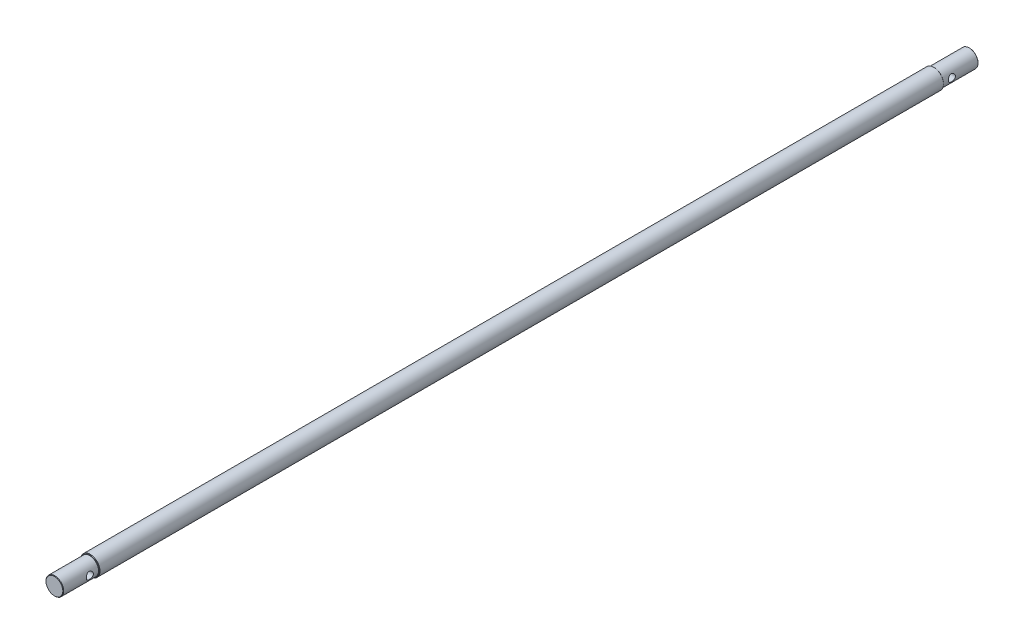
ISO-10303-21;
HEADER;
FILE_DESCRIPTION(('STEP AP214'),'2;1');
FILE_NAME('part.step','',(''),(''),'','','');
FILE_SCHEMA(('AUTOMOTIVE_DESIGN { 1 0 10303 214 1 1 1 1 }'));
ENDSEC;
DATA;
#1=APPLICATION_CONTEXT('core data for automotive mechanical design processes');
#2=APPLICATION_PROTOCOL_DEFINITION('international standard','automotive_design',2000,#1);
#3=PRODUCT_CONTEXT('',#1,'mechanical');
#4=PRODUCT('Part','Part','',(#3));
#5=PRODUCT_RELATED_PRODUCT_CATEGORY('part','',(#4));
#6=PRODUCT_DEFINITION_FORMATION('','',#4);
#7=PRODUCT_DEFINITION_CONTEXT('part definition',#1,'design');
#8=PRODUCT_DEFINITION('design','',#6,#7);
#9=PRODUCT_DEFINITION_SHAPE('','',#8);
#10=(LENGTH_UNIT() NAMED_UNIT(*) SI_UNIT(.MILLI.,.METRE.));
#11=(NAMED_UNIT(*) PLANE_ANGLE_UNIT() SI_UNIT($,.RADIAN.));
#12=(NAMED_UNIT(*) SI_UNIT($,.STERADIAN.) SOLID_ANGLE_UNIT());
#13=UNCERTAINTY_MEASURE_WITH_UNIT(LENGTH_MEASURE(1.E-05),#10,'distance_accuracy_value','');
#14=(GEOMETRIC_REPRESENTATION_CONTEXT(3) GLOBAL_UNCERTAINTY_ASSIGNED_CONTEXT((#13)) GLOBAL_UNIT_ASSIGNED_CONTEXT((#10,
#11,#12)) REPRESENTATION_CONTEXT('',''));
#15=CARTESIAN_POINT('',(0.,0.,0.));
#16=DIRECTION('',(0.,0.,1.));
#17=DIRECTION('',(1.,0.,0.));
#18=AXIS2_PLACEMENT_3D('',#15,#16,#17);
#19=CARTESIAN_POINT('',(0.,0.,0.));
#20=DIRECTION('',(0.,0.,-1.));
#21=DIRECTION('',(-1.,0.,0.));
#22=AXIS2_PLACEMENT_3D('',#19,#20,#21);
#23=PLANE('',#22);
#24=CARTESIAN_POINT('',(0.,0.,0.));
#25=DIRECTION('',(0.,0.,-1.));
#26=DIRECTION('',(-1.,0.,0.));
#27=AXIS2_PLACEMENT_3D('',#24,#25,#26);
#28=CIRCLE('',#27,9.49999999999995);
#29=CARTESIAN_POINT('',(-9.49999999999995,0.,0.));
#30=VERTEX_POINT('',#29);
#31=EDGE_CURVE('E45',#30,#30,#28,.F.);
#32=ORIENTED_EDGE('',*,*,#31,.T.);
#33=EDGE_LOOP('',(#32));
#34=FACE_BOUND('',#33,.T.);
#35=ADVANCED_FACE('F34',(#34),#23,.F.);
#36=CARTESIAN_POINT('',(0.,0.,0.));
#37=DIRECTION('',(0.,0.,1.));
#38=DIRECTION('',(1.,0.,0.));
#39=AXIS2_PLACEMENT_3D('',#36,#37,#38);
#40=CYLINDRICAL_SURFACE('',#39,10.);
#41=CARTESIAN_POINT('',(0.,0.,-0.499999999999971));
#42=DIRECTION('',(0.,0.,-1.));
#43=DIRECTION('',(-1.,0.,0.));
#44=AXIS2_PLACEMENT_3D('',#41,#42,#43);
#45=CIRCLE('',#44,10.);
#46=CARTESIAN_POINT('',(-10.,0.,-0.499999999999971));
#47=VERTEX_POINT('',#46);
#48=EDGE_CURVE('E41',#47,#47,#45,.T.);
#49=ORIENTED_EDGE('',*,*,#48,.T.);
#50=EDGE_LOOP('',(#49));
#51=FACE_BOUND('',#50,.T.);
#52=CARTESIAN_POINT('',(0.,0.,-39.8));
#53=DIRECTION('',(0.,0.,-1.));
#54=DIRECTION('',(-1.,0.,0.));
#55=AXIS2_PLACEMENT_3D('',#52,#53,#54);
#56=CIRCLE('',#55,10.);
#57=CARTESIAN_POINT('',(-10.,0.,-39.8));
#58=VERTEX_POINT('',#57);
#59=EDGE_CURVE('E75',#58,#58,#56,.F.);
#60=ORIENTED_EDGE('',*,*,#59,.T.);
#61=EDGE_LOOP('',(#60));
#62=FACE_BOUND('',#61,.T.);
#63=CARTESIAN_POINT('',(10.,0.,-34.));
#64=CARTESIAN_POINT('',(9.99999886871264,-0.107549581345536,-33.9999984250671));
#65=CARTESIAN_POINT('',(9.99825999367799,-0.21513214794036,-33.9956563289198));
#66=CARTESIAN_POINT('',(9.99134740691108,-0.429535200549547,-33.9783266172161));
#67=CARTESIAN_POINT('',(9.98617152790588,-0.5363551627033,-33.9653335465974));
#68=CARTESIAN_POINT('',(9.97250573560117,-0.748635856497415,-33.9307919654494));
#69=CARTESIAN_POINT('',(9.96400865312144,-0.854093134440868,-33.9092249453802));
#70=CARTESIAN_POINT('',(9.94393017211574,-1.06266761114009,-33.8577582695632));
#71=CARTESIAN_POINT('',(9.932347522545,-1.16578384227259,-33.8278552337447));
#72=CARTESIAN_POINT('',(9.89349112162205,-1.46979509681069,-33.726277191284));
#73=CARTESIAN_POINT('',(9.86204458846134,-1.66629107461992,-33.6425781809936));
#74=CARTESIAN_POINT('',(9.79113035538708,-2.04217417878101,-33.4459537826502));
#75=CARTESIAN_POINT('',(9.75166544086262,-2.22156721456798,-33.3330385398851));
#76=CARTESIAN_POINT('',(9.66661825353092,-2.56699339938208,-33.0755312454783));
#77=CARTESIAN_POINT('',(9.62084608086599,-2.73212223266508,-32.9297872894244));
#78=CARTESIAN_POINT('',(9.52921139577231,-3.03635232313263,-32.613199390848));
#79=CARTESIAN_POINT('',(9.48334885017047,-3.17544084661153,-32.4423432409835));
#80=CARTESIAN_POINT('',(9.39445587657958,-3.42974847409894,-32.0711440314337));
#81=CARTESIAN_POINT('',(9.35164233015934,-3.54362978572887,-31.8698270739362));
#82=CARTESIAN_POINT('',(9.2766729328807,-3.73550961465233,-31.4489271571991));
#83=CARTESIAN_POINT('',(9.24451202207146,-3.81352517485722,-31.2293529322586));
#84=CARTESIAN_POINT('',(9.19652715590089,-3.92779760260541,-30.7885753443142));
#85=CARTESIAN_POINT('',(9.18002840771385,-3.96578791979826,-30.5678975319119));
#86=CARTESIAN_POINT('',(9.16328008038143,-4.00434593508727,-30.1227300003227));
#87=CARTESIAN_POINT('',(9.16302251073203,-4.00493203570086,-29.8982422099889));
#88=CARTESIAN_POINT('',(9.17821000534302,-3.96997873214739,-29.4684866577768));
#89=CARTESIAN_POINT('',(9.19256349925667,-3.93695062778272,-29.2629685712344));
#90=CARTESIAN_POINT('',(9.23352375055553,-3.83989376129507,-28.8606808876497));
#91=CARTESIAN_POINT('',(9.26013264599921,-3.77585958980134,-28.6639128236937));
#92=CARTESIAN_POINT('',(9.32318970221162,-3.6173894649114,-28.2799643277081));
#93=CARTESIAN_POINT('',(9.35982758573424,-3.52235972457938,-28.0930615219175));
#94=CARTESIAN_POINT('',(9.43876232767927,-3.30501292151569,-27.73716836725));
#95=CARTESIAN_POINT('',(9.48106130910412,-3.18268561021589,-27.5681847811869));
#96=CARTESIAN_POINT('',(9.57053473488081,-2.90310119889355,-27.239180542404));
#97=CARTESIAN_POINT('',(9.61783329953252,-2.74387492593716,-27.0808625411101));
#98=CARTESIAN_POINT('',(9.70919649915615,-2.40062885486449,-26.7926310439938));
#99=CARTESIAN_POINT('',(9.75326048890393,-2.21660413066997,-26.6627232051788));
#100=CARTESIAN_POINT('',(9.83429362529359,-1.82415530521055,-26.4327651051689));
#101=CARTESIAN_POINT('',(9.87110540190899,-1.61532098269265,-26.3333554376061));
#102=CARTESIAN_POINT('',(9.93229656657448,-1.18204753096605,-26.1716642778437));
#103=CARTESIAN_POINT('',(9.95668226924746,-0.957616393699396,-26.1093639248851));
#104=CARTESIAN_POINT('',(9.98912279013839,-0.513791775215588,-26.0271034091606));
#105=CARTESIAN_POINT('',(9.99805891667034,-0.294886587971138,-26.0048550914929));
#106=CARTESIAN_POINT('',(10.0013695702126,0.143690619615708,-25.9965737989427));
#107=CARTESIAN_POINT('',(9.99574787164577,0.363362426448185,-26.0105314369048));
#108=CARTESIAN_POINT('',(9.97115134127512,0.786865478243656,-26.0725835051041));
#109=CARTESIAN_POINT('',(9.95278782691064,0.990964983549763,-26.1191159607025));
#110=CARTESIAN_POINT('',(9.90518882810983,1.38827085612275,-26.2428714166191));
#111=CARTESIAN_POINT('',(9.87595194712999,1.58147582045412,-26.3200983593352));
#112=CARTESIAN_POINT('',(9.80833189541687,1.95815757162884,-26.5055698793621));
#113=CARTESIAN_POINT('',(9.76969631959847,2.14115604549353,-26.6146909440947));
#114=CARTESIAN_POINT('',(9.68746729490809,2.4868871825104,-26.8598806478029));
#115=CARTESIAN_POINT('',(9.64387186219643,2.64961168158684,-26.9959600858139));
#116=CARTESIAN_POINT('',(9.55290235277181,2.96144608598878,-27.3017400259326));
#117=CARTESIAN_POINT('',(9.50546882853787,3.10894786734725,-27.4730670831409));
#118=CARTESIAN_POINT('',(9.41483345830581,3.37350239509234,-27.8388801658903));
#119=CARTESIAN_POINT('',(9.37163231039242,3.4905501236659,-28.0333700001995));
#120=CARTESIAN_POINT('',(9.2942859982933,3.69161500286277,-28.4429233896733));
#121=CARTESIAN_POINT('',(9.26023261821741,3.77530118531766,-28.6581680002435));
#122=CARTESIAN_POINT('',(9.20647346903737,3.90459244315908,-29.1014673016128));
#123=CARTESIAN_POINT('',(9.18675711197461,3.95022562452797,-29.3295124048418));
#124=CARTESIAN_POINT('',(9.1654351878039,3.99943122157416,-29.774255809844));
#125=CARTESIAN_POINT('',(9.16262842667612,4.00579411777209,-29.990589701895));
#126=CARTESIAN_POINT('',(9.17229671415009,3.98360636538273,-30.4210896927211));
#127=CARTESIAN_POINT('',(9.18476982225497,3.95506015014709,-30.6352560632825));
#128=CARTESIAN_POINT('',(9.2225330048627,3.86614256488128,-31.0466644608903));
#129=CARTESIAN_POINT('',(9.2472967218297,3.80707437387706,-31.2442408462211));
#130=CARTESIAN_POINT('',(9.30647993934966,3.66001151041637,-31.6267569617897));
#131=CARTESIAN_POINT('',(9.34090210615105,3.5720088493455,-31.8116931851113));
#132=CARTESIAN_POINT('',(9.41797252826471,3.36374310804132,-32.1752204107095));
#133=CARTESIAN_POINT('',(9.46097893410836,3.24192140926542,-32.3528418306883));
#134=CARTESIAN_POINT('',(9.54927479921252,2.97179350239176,-32.6859821426248));
#135=CARTESIAN_POINT('',(9.59456494363941,2.8234793116858,-32.84149434729));
#136=CARTESIAN_POINT('',(9.68587647140965,2.49297412446699,-33.1364235925306));
#137=CARTESIAN_POINT('',(9.73175488236393,2.30921017071954,-33.2741433839823));
#138=CARTESIAN_POINT('',(9.7949502762577,2.01716584575532,-33.4560481089375));
#139=CARTESIAN_POINT('',(9.81509269692655,1.91699501972424,-33.512607063853));
#140=CARTESIAN_POINT('',(9.85294835133019,1.71180110982479,-33.6170379954053));
#141=CARTESIAN_POINT('',(9.87066269647665,1.60678027559741,-33.664913949808));
#142=CARTESIAN_POINT('',(9.9028559935491,1.39454646904328,-33.750747984685));
#143=CARTESIAN_POINT('',(9.91738778532477,1.28740777135871,-33.7888701547472));
#144=CARTESIAN_POINT('',(9.94319722915714,1.06995577523383,-33.8559213477212));
#145=CARTESIAN_POINT('',(9.95447639837582,0.959643983352614,-33.8848546573499));
#146=CARTESIAN_POINT('',(9.97343330649399,0.736945215856832,-33.933174836149));
#147=CARTESIAN_POINT('',(9.98112017494336,0.624564263591279,-33.952585911645));
#148=CARTESIAN_POINT('',(9.99270031578293,0.398419132407603,-33.9817385706662));
#149=CARTESIAN_POINT('',(9.99659628445551,0.284655994966353,-33.9914870268343));
#150=CARTESIAN_POINT('',(9.99951445883957,0.113830463425492,-33.9987858955734));
#151=CARTESIAN_POINT('',(10.0000005987258,0.05691985126453,-34.000000833522));
#152=CARTESIAN_POINT('',(10.,0.,-34.));
#153=B_SPLINE_CURVE_WITH_KNOTS('',3,(#63,#64,#65,#66,#67,#68,#69,#70,#71,#72,#73,#74,#75,#76,
#77,#78,#79,#80,#81,#82,#83,#84,#85,#86,#87,#88,#89,#90,#91,#92,#93,#94,#95,#96,#97,#98,#99,
#100,#101,#102,#103,#104,#105,#106,#107,#108,#109,#110,#111,#112,#113,#114,#115,#116,#117,#118,
#119,#120,#121,#122,#123,#124,#125,#126,#127,#128,#129,#130,#131,#132,#133,#134,#135,#136,#137,
#138,#139,#140,#141,#142,#143,#144,#145,#146,#147,#148,#149,#150,#151,#152),.UNSPECIFIED.,.T.,
.F.,(4,2,2,2,2,2,2,2,2,2,2,2,2,2,2,2,2,2,2,2,2,2,2,2,2,2,2,2,2,2,2,2,2,2,2,2,2,2,2,2,2,2,2,2,4),
(0.,0.322603993422154,0.645411604786481,0.968919914471234,1.29255959093094,1.93701523385823,
2.58124739027476,3.25313995292301,3.9253602176033,4.62749749529941,5.32930078128043,
5.99927442509164,6.66891844572482,7.29195888698821,7.91510806412269,8.55097484497806,
9.1870807577654,9.87235930273288,10.5577741757964,11.2567305822579,11.9553314412775,
12.6125760095619,13.2696501904034,13.897201430289,14.5248332988777,15.171662586967,
15.8187515089811,16.50856181149,17.1984856998767,17.8950932218183,18.5911857719204,
19.2371857868567,19.8831037702626,20.5034786899771,21.1240250351049,21.7801016801356,
22.4363763459696,23.1352007896784,23.4851924266232,23.8350233218042,24.1785111324565,
24.52183846562,24.8642884495951,25.2064946871486,25.3772305569976),.UNSPECIFIED.);
#154=CARTESIAN_POINT('',(10.,0.,-34.));
#155=VERTEX_POINT('',#154);
#156=EDGE_CURVE('E87',#155,#155,#153,.T.);
#157=ORIENTED_EDGE('',*,*,#156,.T.);
#158=EDGE_LOOP('',(#157));
#159=FACE_BOUND('',#158,.T.);
#160=CARTESIAN_POINT('',(-10.,0.,-26.));
#161=CARTESIAN_POINT('',(-9.99999886871264,-0.107549581345536,-26.0000015749329));
#162=CARTESIAN_POINT('',(-9.99825999367799,-0.21513214794036,-26.0043436710802));
#163=CARTESIAN_POINT('',(-9.99134740691108,-0.429535200549547,-26.0216733827839));
#164=CARTESIAN_POINT('',(-9.98617152790588,-0.536355162703299,-26.0346664534026));
#165=CARTESIAN_POINT('',(-9.97250573560118,-0.748635856497414,-26.0692080345506));
#166=CARTESIAN_POINT('',(-9.96400865312144,-0.854093134440867,-26.0907750546198));
#167=CARTESIAN_POINT('',(-9.94393017211574,-1.06266761114009,-26.1422417304368));
#168=CARTESIAN_POINT('',(-9.932347522545,-1.16578384227259,-26.1721447662553));
#169=CARTESIAN_POINT('',(-9.89349112162205,-1.46979509681069,-26.273722808716));
#170=CARTESIAN_POINT('',(-9.86204458846134,-1.66629107461992,-26.3574218190064));
#171=CARTESIAN_POINT('',(-9.79113035538708,-2.04217417878101,-26.5540462173498));
#172=CARTESIAN_POINT('',(-9.75166544086263,-2.22156721456798,-26.6669614601149));
#173=CARTESIAN_POINT('',(-9.66661825353092,-2.56699339938208,-26.9244687545217));
#174=CARTESIAN_POINT('',(-9.62084608086599,-2.73212223266508,-27.0702127105756));
#175=CARTESIAN_POINT('',(-9.52921139577231,-3.03635232313263,-27.386800609152));
#176=CARTESIAN_POINT('',(-9.48334885017047,-3.17544084661153,-27.5576567590165));
#177=CARTESIAN_POINT('',(-9.39445587657958,-3.42974847409894,-27.9288559685663));
#178=CARTESIAN_POINT('',(-9.35164233015934,-3.54362978572887,-28.1301729260637));
#179=CARTESIAN_POINT('',(-9.2766729328807,-3.73550961465233,-28.5510728428009));
#180=CARTESIAN_POINT('',(-9.24451202207146,-3.81352517485722,-28.7706470677414));
#181=CARTESIAN_POINT('',(-9.19652715590089,-3.92779760260541,-29.2114246556858));
#182=CARTESIAN_POINT('',(-9.18002840771385,-3.96578791979826,-29.4321024680881));
#183=CARTESIAN_POINT('',(-9.16328008038143,-4.00434593508727,-29.8772699996773));
#184=CARTESIAN_POINT('',(-9.16302251073203,-4.00493203570086,-30.1017577900111));
#185=CARTESIAN_POINT('',(-9.17821000534302,-3.96997873214739,-30.5315133422232));
#186=CARTESIAN_POINT('',(-9.19256349925667,-3.93695062778272,-30.7370314287657));
#187=CARTESIAN_POINT('',(-9.23352375055553,-3.83989376129507,-31.1393191123503));
#188=CARTESIAN_POINT('',(-9.26013264599922,-3.77585958980134,-31.3360871763063));
#189=CARTESIAN_POINT('',(-9.32318970221162,-3.6173894649114,-31.7200356722919));
#190=CARTESIAN_POINT('',(-9.35982758573424,-3.52235972457938,-31.9069384780825));
#191=CARTESIAN_POINT('',(-9.43876232767927,-3.30501292151569,-32.26283163275));
#192=CARTESIAN_POINT('',(-9.48106130910412,-3.18268561021589,-32.4318152188131));
#193=CARTESIAN_POINT('',(-9.57053473488081,-2.90310119889355,-32.760819457596));
#194=CARTESIAN_POINT('',(-9.61783329953252,-2.74387492593716,-32.9191374588899));
#195=CARTESIAN_POINT('',(-9.70919649915615,-2.40062885486448,-33.2073689560062));
#196=CARTESIAN_POINT('',(-9.75326048890393,-2.21660413066997,-33.3372767948212));
#197=CARTESIAN_POINT('',(-9.83429362529359,-1.82415530521055,-33.5672348948311));
#198=CARTESIAN_POINT('',(-9.87110540190899,-1.61532098269265,-33.6666445623939));
#199=CARTESIAN_POINT('',(-9.93229656657448,-1.18204753096606,-33.8283357221563));
#200=CARTESIAN_POINT('',(-9.95668226924746,-0.957616393699399,-33.8906360751149));
#201=CARTESIAN_POINT('',(-9.98912279013839,-0.513791775215591,-33.9728965908394));
#202=CARTESIAN_POINT('',(-9.99805891667034,-0.294886587971141,-33.9951449085071));
#203=CARTESIAN_POINT('',(-10.0013695702126,0.143690619615705,-34.0034262010573));
#204=CARTESIAN_POINT('',(-9.99574787164577,0.363362426448182,-33.9894685630952));
#205=CARTESIAN_POINT('',(-9.97115134127512,0.786865478243654,-33.9274164948959));
#206=CARTESIAN_POINT('',(-9.95278782691064,0.990964983549761,-33.8808840392975));
#207=CARTESIAN_POINT('',(-9.90518882810983,1.38827085612275,-33.7571285833809));
#208=CARTESIAN_POINT('',(-9.87595194712999,1.58147582045412,-33.6799016406648));
#209=CARTESIAN_POINT('',(-9.80833189541687,1.95815757162883,-33.4944301206379));
#210=CARTESIAN_POINT('',(-9.76969631959847,2.14115604549353,-33.3853090559053));
#211=CARTESIAN_POINT('',(-9.68746729490809,2.48688718251039,-33.1401193521971));
#212=CARTESIAN_POINT('',(-9.64387186219643,2.64961168158684,-33.0040399141861));
#213=CARTESIAN_POINT('',(-9.55290235277181,2.96144608598878,-32.6982599740674));
#214=CARTESIAN_POINT('',(-9.50546882853787,3.10894786734725,-32.5269329168592));
#215=CARTESIAN_POINT('',(-9.41483345830581,3.37350239509234,-32.1611198341097));
#216=CARTESIAN_POINT('',(-9.37163231039242,3.4905501236659,-31.9666299998006));
#217=CARTESIAN_POINT('',(-9.2942859982933,3.69161500286276,-31.5570766103267));
#218=CARTESIAN_POINT('',(-9.26023261821741,3.77530118531765,-31.3418319997565));
#219=CARTESIAN_POINT('',(-9.20647346903737,3.90459244315908,-30.8985326983872));
#220=CARTESIAN_POINT('',(-9.18675711197461,3.95022562452797,-30.6704875951582));
#221=CARTESIAN_POINT('',(-9.1654351878039,3.99943122157416,-30.225744190156));
#222=CARTESIAN_POINT('',(-9.16262842667612,4.00579411777209,-30.009410298105));
#223=CARTESIAN_POINT('',(-9.17229671415009,3.98360636538273,-29.5789103072789));
#224=CARTESIAN_POINT('',(-9.18476982225497,3.95506015014709,-29.3647439367175));
#225=CARTESIAN_POINT('',(-9.2225330048627,3.86614256488129,-28.9533355391097));
#226=CARTESIAN_POINT('',(-9.2472967218297,3.80707437387706,-28.7557591537789));
#227=CARTESIAN_POINT('',(-9.30647993934966,3.66001151041637,-28.3732430382103));
#228=CARTESIAN_POINT('',(-9.34090210615105,3.5720088493455,-28.1883068148887));
#229=CARTESIAN_POINT('',(-9.41797252826471,3.36374310804132,-27.8247795892905));
#230=CARTESIAN_POINT('',(-9.46097893410836,3.24192140926543,-27.6471581693117));
#231=CARTESIAN_POINT('',(-9.54927479921252,2.97179350239176,-27.3140178573752));
#232=CARTESIAN_POINT('',(-9.59456494363941,2.82347931168581,-27.15850565271));
#233=CARTESIAN_POINT('',(-9.68587647140965,2.49297412446699,-26.8635764074694));
#234=CARTESIAN_POINT('',(-9.73175488236393,2.30921017071955,-26.7258566160177));
#235=CARTESIAN_POINT('',(-9.7949502762577,2.01716584575533,-26.5439518910625));
#236=CARTESIAN_POINT('',(-9.81509269692655,1.91699501972424,-26.487392936147));
#237=CARTESIAN_POINT('',(-9.85294835133019,1.71180110982479,-26.3829620045947));
#238=CARTESIAN_POINT('',(-9.87066269647665,1.60678027559742,-26.335086050192));
#239=CARTESIAN_POINT('',(-9.9028559935491,1.39454646904328,-26.249252015315));
#240=CARTESIAN_POINT('',(-9.91738778532477,1.28740777135872,-26.2111298452528));
#241=CARTESIAN_POINT('',(-9.94319722915714,1.06995577523383,-26.1440786522788));
#242=CARTESIAN_POINT('',(-9.95447639837582,0.959643983352617,-26.1151453426501));
#243=CARTESIAN_POINT('',(-9.97343330649399,0.736945215856834,-26.066825163851));
#244=CARTESIAN_POINT('',(-9.98112017494336,0.62456426359128,-26.047414088355));
#245=CARTESIAN_POINT('',(-9.99270031578293,0.398419132407603,-26.0182614293338));
#246=CARTESIAN_POINT('',(-9.99659628445551,0.284655994966353,-26.0085129731657));
#247=CARTESIAN_POINT('',(-9.99951445883957,0.113830463425492,-26.0012141044266));
#248=CARTESIAN_POINT('',(-10.0000005987258,0.0569198512645301,-25.999999166478));
#249=CARTESIAN_POINT('',(-10.,0.,-26.));
#250=B_SPLINE_CURVE_WITH_KNOTS('',3,(#160,#161,#162,#163,#164,#165,#166,#167,#168,#169,#170,
#171,#172,#173,#174,#175,#176,#177,#178,#179,#180,#181,#182,#183,#184,#185,#186,#187,#188,#189,
#190,#191,#192,#193,#194,#195,#196,#197,#198,#199,#200,#201,#202,#203,#204,#205,#206,#207,#208,
#209,#210,#211,#212,#213,#214,#215,#216,#217,#218,#219,#220,#221,#222,#223,#224,#225,#226,#227,
#228,#229,#230,#231,#232,#233,#234,#235,#236,#237,#238,#239,#240,#241,#242,#243,#244,#245,#246,
#247,#248,#249),.UNSPECIFIED.,.T.,.F.,(4,2,2,2,2,2,2,2,2,2,2,2,2,2,2,2,2,2,2,2,2,2,2,2,2,2,2,2,
2,2,2,2,2,2,2,2,2,2,2,2,2,2,2,2,4),(0.,0.322603993422154,0.64541160478648,0.968919914471234,
1.29255959093094,1.93701523385823,2.58124739027476,3.25313995292301,3.9253602176033,
4.62749749529941,5.32930078128043,5.99927442509164,6.66891844572483,7.29195888698822,
7.9151080641227,8.55097484497805,9.1870807577654,9.87235930273288,10.5577741757964,
11.2567305822579,11.9553314412775,12.6125760095619,13.2696501904034,13.897201430289,
14.5248332988777,15.171662586967,15.8187515089811,16.50856181149,17.1984856998767,
17.8950932218183,18.5911857719204,19.2371857868567,19.8831037702626,20.5034786899771,
21.124025035105,21.7801016801356,22.4363763459696,23.1352007896784,23.4851924266232,
23.8350233218042,24.1785111324565,24.52183846562,24.8642884495951,25.2064946871486,
25.3772305569976),.UNSPECIFIED.);
#251=CARTESIAN_POINT('',(-10.,0.,-26.));
#252=VERTEX_POINT('',#251);
#253=EDGE_CURVE('E110',#252,#252,#250,.T.);
#254=ORIENTED_EDGE('',*,*,#253,.T.);
#255=EDGE_LOOP('',(#254));
#256=FACE_BOUND('',#255,.T.);
#257=ADVANCED_FACE('F119',(#51,#62,#159,#256),#40,.T.);
#258=CARTESIAN_POINT('',(0.,10.,-40.));
#259=DIRECTION('',(0.,0.,-1.));
#260=DIRECTION('',(-1.,0.,0.));
#261=AXIS2_PLACEMENT_3D('',#258,#259,#260);
#262=PLANE('',#261);
#263=CARTESIAN_POINT('',(0.,0.,-40.));
#264=DIRECTION('',(0.,0.,-1.));
#265=DIRECTION('',(-1.,0.,0.));
#266=AXIS2_PLACEMENT_3D('',#263,#264,#265);
#267=CIRCLE('',#266,10.4999999999998);
#268=CARTESIAN_POINT('',(-10.4999999999998,0.,-40.));
#269=VERTEX_POINT('',#268);
#270=EDGE_CURVE('E10',#269,#269,#267,.F.);
#271=ORIENTED_EDGE('',*,*,#270,.T.);
#272=EDGE_LOOP('',(#271));
#273=FACE_BOUND('',#272,.T.);
#274=CARTESIAN_POINT('',(0.,0.,-40.));
#275=DIRECTION('',(0.,0.,-1.));
#276=DIRECTION('',(-1.,0.,0.));
#277=AXIS2_PLACEMENT_3D('',#274,#275,#276);
#278=CIRCLE('',#277,10.2);
#279=CARTESIAN_POINT('',(-10.2,0.,-40.));
#280=VERTEX_POINT('',#279);
#281=EDGE_CURVE('E72',#280,#280,#278,.T.);
#282=ORIENTED_EDGE('',*,*,#281,.T.);
#283=EDGE_LOOP('',(#282));
#284=FACE_BOUND('',#283,.T.);
#285=ADVANCED_FACE('F124',(#273,#284),#262,.F.);
#286=CARTESIAN_POINT('',(0.,0.,0.));
#287=DIRECTION('',(0.,0.,1.));
#288=DIRECTION('',(1.,0.,0.));
#289=AXIS2_PLACEMENT_3D('',#286,#287,#288);
#290=CYLINDRICAL_SURFACE('',#289,11.);
#291=CARTESIAN_POINT('',(0.,0.,-993.5));
#292=DIRECTION('',(0.,0.,1.));
#293=DIRECTION('',(1.,0.,0.));
#294=AXIS2_PLACEMENT_3D('',#291,#292,#293);
#295=CIRCLE('',#294,11.);
#296=CARTESIAN_POINT('',(11.,0.,-993.5));
#297=VERTEX_POINT('',#296);
#298=EDGE_CURVE('E60',#297,#297,#295,.T.);
#299=ORIENTED_EDGE('',*,*,#298,.T.);
#300=EDGE_LOOP('',(#299));
#301=FACE_BOUND('',#300,.T.);
#302=CARTESIAN_POINT('',(0.,0.,-40.5000000000001));
#303=DIRECTION('',(0.,0.,-1.));
#304=DIRECTION('',(-1.,0.,0.));
#305=AXIS2_PLACEMENT_3D('',#302,#303,#304);
#306=CIRCLE('',#305,11.);
#307=CARTESIAN_POINT('',(-11.,0.,-40.5000000000001));
#308=VERTEX_POINT('',#307);
#309=EDGE_CURVE('E63',#308,#308,#306,.T.);
#310=ORIENTED_EDGE('',*,*,#309,.T.);
#311=EDGE_LOOP('',(#310));
#312=FACE_BOUND('',#311,.T.);
#313=ADVANCED_FACE('F158',(#301,#312),#290,.T.);
#314=CARTESIAN_POINT('',(0.,11.,-994.));
#315=DIRECTION('',(0.,0.,1.));
#316=DIRECTION('',(1.,0.,0.));
#317=AXIS2_PLACEMENT_3D('',#314,#315,#316);
#318=PLANE('',#317);
#319=CARTESIAN_POINT('',(0.,0.,-994.));
#320=DIRECTION('',(0.,0.,1.));
#321=DIRECTION('',(1.,0.,0.));
#322=AXIS2_PLACEMENT_3D('',#319,#320,#321);
#323=CIRCLE('',#322,10.5);
#324=CARTESIAN_POINT('',(10.5,0.,-994.));
#325=VERTEX_POINT('',#324);
#326=EDGE_CURVE('E57',#325,#325,#323,.F.);
#327=ORIENTED_EDGE('',*,*,#326,.T.);
#328=EDGE_LOOP('',(#327));
#329=FACE_BOUND('',#328,.T.);
#330=CARTESIAN_POINT('',(0.,0.,-994.));
#331=DIRECTION('',(0.,0.,1.));
#332=DIRECTION('',(1.,0.,0.));
#333=AXIS2_PLACEMENT_3D('',#330,#331,#332);
#334=CIRCLE('',#333,10.2);
#335=CARTESIAN_POINT('',(10.2,0.,-994.));
#336=VERTEX_POINT('',#335);
#337=EDGE_CURVE('E69',#336,#336,#334,.T.);
#338=ORIENTED_EDGE('',*,*,#337,.T.);
#339=EDGE_LOOP('',(#338));
#340=FACE_BOUND('',#339,.T.);
#341=ADVANCED_FACE('F160',(#329,#340),#318,.F.);
#342=CARTESIAN_POINT('',(0.,0.,0.));
#343=DIRECTION('',(0.,0.,1.));
#344=DIRECTION('',(1.,0.,0.));
#345=AXIS2_PLACEMENT_3D('',#342,#343,#344);
#346=CYLINDRICAL_SURFACE('',#345,10.);
#347=CARTESIAN_POINT('',(0.,0.,-1033.5));
#348=DIRECTION('',(0.,0.,1.));
#349=DIRECTION('',(1.,0.,0.));
#350=AXIS2_PLACEMENT_3D('',#347,#348,#349);
#351=CIRCLE('',#350,10.);
#352=CARTESIAN_POINT('',(10.,0.,-1033.5));
#353=VERTEX_POINT('',#352);
#354=EDGE_CURVE('E54',#353,#353,#351,.T.);
#355=ORIENTED_EDGE('',*,*,#354,.T.);
#356=EDGE_LOOP('',(#355));
#357=FACE_BOUND('',#356,.T.);
#358=CARTESIAN_POINT('',(0.,0.,-994.2));
#359=DIRECTION('',(0.,0.,1.));
#360=DIRECTION('',(1.,0.,0.));
#361=AXIS2_PLACEMENT_3D('',#358,#359,#360);
#362=CIRCLE('',#361,10.);
#363=CARTESIAN_POINT('',(10.,0.,-994.2));
#364=VERTEX_POINT('',#363);
#365=EDGE_CURVE('E66',#364,#364,#362,.F.);
#366=ORIENTED_EDGE('',*,*,#365,.T.);
#367=EDGE_LOOP('',(#366));
#368=FACE_BOUND('',#367,.T.);
#369=CARTESIAN_POINT('',(10.,0.,-1008.));
#370=CARTESIAN_POINT('',(9.99999886871264,-0.10754958134554,-1007.99999842507));
#371=CARTESIAN_POINT('',(9.99825999367799,-0.215132147940364,-1007.99565632892));
#372=CARTESIAN_POINT('',(9.99134740691108,-0.429535200549553,-1007.97832661722));
#373=CARTESIAN_POINT('',(9.98617152790588,-0.536355162703307,-1007.9653335466));
#374=CARTESIAN_POINT('',(9.97250573560118,-0.748635856497427,-1007.93079196545));
#375=CARTESIAN_POINT('',(9.96400865312143,-0.854093134440882,-1007.90922494538));
#376=CARTESIAN_POINT('',(9.94393017211573,-1.06266761114011,-1007.85775826956));
#377=CARTESIAN_POINT('',(9.93234752254499,-1.16578384227261,-1007.82785523374));
#378=CARTESIAN_POINT('',(9.89349112162205,-1.4697950968107,-1007.72627719128));
#379=CARTESIAN_POINT('',(9.86204458846135,-1.66629107461991,-1007.64257818099));
#380=CARTESIAN_POINT('',(9.79113035538709,-2.042174178781,-1007.44595378265));
#381=CARTESIAN_POINT('',(9.75166544086262,-2.22156721456799,-1007.33303853989));
#382=CARTESIAN_POINT('',(9.6666182535309,-2.56699339938214,-1007.07553124548));
#383=CARTESIAN_POINT('',(9.62084608086597,-2.73212223266516,-1006.92978728942));
#384=CARTESIAN_POINT('',(9.52921139577229,-3.0363523231327,-1006.61319939085));
#385=CARTESIAN_POINT('',(9.48334885017045,-3.17544084661158,-1006.44234324098));
#386=CARTESIAN_POINT('',(9.39445587657958,-3.42974847409896,-1006.07114403143));
#387=CARTESIAN_POINT('',(9.35164233015934,-3.54362978572888,-1005.86982707394));
#388=CARTESIAN_POINT('',(9.2766729328807,-3.73550961465234,-1005.4489271572));
#389=CARTESIAN_POINT('',(9.24451202207145,-3.81352517485724,-1005.22935293226));
#390=CARTESIAN_POINT('',(9.19652715590089,-3.92779760260541,-1004.78857534431));
#391=CARTESIAN_POINT('',(9.18002840771386,-3.96578791979824,-1004.56789753191));
#392=CARTESIAN_POINT('',(9.16328008038143,-4.00434593508727,-1004.12273000032));
#393=CARTESIAN_POINT('',(9.16302251073203,-4.00493203570086,-1003.89824220999));
#394=CARTESIAN_POINT('',(9.17821000534302,-3.96997873214738,-1003.46848665778));
#395=CARTESIAN_POINT('',(9.19256349925668,-3.93695062778268,-1003.26296857123));
#396=CARTESIAN_POINT('',(9.23352375055555,-3.83989376129502,-1002.86068088765));
#397=CARTESIAN_POINT('',(9.26013264599923,-3.77585958980132,-1002.66391282369));
#398=CARTESIAN_POINT('',(9.32318970221161,-3.61738946491144,-1002.27996432771));
#399=CARTESIAN_POINT('',(9.35982758573422,-3.52235972457945,-1002.09306152192));
#400=CARTESIAN_POINT('',(9.43876232767925,-3.30501292151573,-1001.73716836725));
#401=CARTESIAN_POINT('',(9.48106130910412,-3.18268561021589,-1001.56818478119));
#402=CARTESIAN_POINT('',(9.57053473488082,-2.90310119889352,-1001.2391805424));
#403=CARTESIAN_POINT('',(9.61783329953253,-2.74387492593715,-1001.08086254111));
#404=CARTESIAN_POINT('',(9.70919649915615,-2.40062885486448,-1000.79263104399));
#405=CARTESIAN_POINT('',(9.75326048890394,-2.21660413066995,-1000.66272320518));
#406=CARTESIAN_POINT('',(9.83429362529359,-1.82415530521049,-1000.43276510517));
#407=CARTESIAN_POINT('',(9.871105401909,-1.6153209826926,-1000.33335543761));
#408=CARTESIAN_POINT('',(9.93229656657448,-1.18204753096601,-1000.17166427784));
#409=CARTESIAN_POINT('',(9.95668226924746,-0.957616393699362,-1000.10936392488));
#410=CARTESIAN_POINT('',(9.98912279013839,-0.513791775215564,-1000.02710340916));
#411=CARTESIAN_POINT('',(9.99805891667034,-0.294886587971114,-1000.00485509149));
#412=CARTESIAN_POINT('',(10.0013695702126,0.143690619615732,-999.996573798943));
#413=CARTESIAN_POINT('',(9.99574787164577,0.363362426448208,-1000.0105314369));
#414=CARTESIAN_POINT('',(9.97115134127512,0.786865478243662,-1000.0725835051));
#415=CARTESIAN_POINT('',(9.95278782691064,0.990964983549753,-1000.1191159607));
#416=CARTESIAN_POINT('',(9.90518882810983,1.38827085612275,-1000.24287141662));
#417=CARTESIAN_POINT('',(9.87595194712999,1.58147582045415,-1000.32009835934));
#418=CARTESIAN_POINT('',(9.80833189541686,1.95815757162888,-1000.50556987936));
#419=CARTESIAN_POINT('',(9.76969631959847,2.14115604549355,-1000.61469094409));
#420=CARTESIAN_POINT('',(9.68746729490809,2.48688718251041,-1000.8598806478));
#421=CARTESIAN_POINT('',(9.64387186219642,2.64961168158686,-1000.99596008581));
#422=CARTESIAN_POINT('',(9.55290235277181,2.96144608598879,-1001.30174002593));
#423=CARTESIAN_POINT('',(9.50546882853788,3.10894786734725,-1001.47306708314));
#424=CARTESIAN_POINT('',(9.41483345830581,3.37350239509233,-1001.83888016589));
#425=CARTESIAN_POINT('',(9.37163231039242,3.4905501236659,-1002.0333700002));
#426=CARTESIAN_POINT('',(9.2942859982933,3.69161500286276,-1002.44292338967));
#427=CARTESIAN_POINT('',(9.26023261821742,3.77530118531763,-1002.65816800024));
#428=CARTESIAN_POINT('',(9.20647346903738,3.90459244315905,-1003.10146730161));
#429=CARTESIAN_POINT('',(9.18675711197461,3.95022562452797,-1003.32951240484));
#430=CARTESIAN_POINT('',(9.16543518780389,3.99943122157418,-1003.77425580984));
#431=CARTESIAN_POINT('',(9.16262842667612,4.00579411777209,-1003.9905897019));
#432=CARTESIAN_POINT('',(9.17229671415011,3.9836063653827,-1004.42108969272));
#433=CARTESIAN_POINT('',(9.18476982225499,3.95506015014704,-1004.63525606328));
#434=CARTESIAN_POINT('',(9.22253300486273,3.86614256488123,-1005.04666446089));
#435=CARTESIAN_POINT('',(9.24729672182971,3.80707437387704,-1005.24424084622));
#436=CARTESIAN_POINT('',(9.30647993934965,3.66001151041638,-1005.62675696179));
#437=CARTESIAN_POINT('',(9.34090210615106,3.57200884934548,-1005.81169318511));
#438=CARTESIAN_POINT('',(9.41797252826473,3.36374310804127,-1006.17522041071));
#439=CARTESIAN_POINT('',(9.46097893410839,3.24192140926535,-1006.35284183069));
#440=CARTESIAN_POINT('',(9.54927479921255,2.97179350239165,-1006.68598214263));
#441=CARTESIAN_POINT('',(9.59456494363945,2.82347931168568,-1006.84149434729));
#442=CARTESIAN_POINT('',(9.68587647140969,2.49297412446683,-1007.13642359253));
#443=CARTESIAN_POINT('',(9.73175488236397,2.30921017071935,-1007.27414338398));
#444=CARTESIAN_POINT('',(9.79495027625773,2.01716584575521,-1007.45604810894));
#445=CARTESIAN_POINT('',(9.81509269692657,1.91699501972418,-1007.51260706385));
#446=CARTESIAN_POINT('',(9.8529483513302,1.71180110982475,-1007.61703799541));
#447=CARTESIAN_POINT('',(9.87066269647667,1.60678027559734,-1007.66491394981));
#448=CARTESIAN_POINT('',(9.90285599354912,1.39454646904316,-1007.75074798468));
#449=CARTESIAN_POINT('',(9.91738778532478,1.2874077713586,-1007.78887015475));
#450=CARTESIAN_POINT('',(9.94319722915715,1.06995577523373,-1007.85592134772));
#451=CARTESIAN_POINT('',(9.95447639837583,0.959643983352529,-1007.88485465735));
#452=CARTESIAN_POINT('',(9.97343330649399,0.736945215856749,-1007.93317483615));
#453=CARTESIAN_POINT('',(9.98112017494336,0.624564263591187,-1007.95258591164));
#454=CARTESIAN_POINT('',(9.99270031578293,0.398419132407528,-1007.98173857067));
#455=CARTESIAN_POINT('',(9.99659628445551,0.284655994966303,-1007.99148702683));
#456=CARTESIAN_POINT('',(9.99951445883957,0.113830463425472,-1007.99878589557));
#457=CARTESIAN_POINT('',(10.0000005987258,0.0569198512645192,-1008.00000083352));
#458=CARTESIAN_POINT('',(10.,0.,-1008.));
#459=B_SPLINE_CURVE_WITH_KNOTS('',3,(#369,#370,#371,#372,#373,#374,#375,#376,#377,#378,#379,
#380,#381,#382,#383,#384,#385,#386,#387,#388,#389,#390,#391,#392,#393,#394,#395,#396,#397,#398,
#399,#400,#401,#402,#403,#404,#405,#406,#407,#408,#409,#410,#411,#412,#413,#414,#415,#416,#417,
#418,#419,#420,#421,#422,#423,#424,#425,#426,#427,#428,#429,#430,#431,#432,#433,#434,#435,#436,
#437,#438,#439,#440,#441,#442,#443,#444,#445,#446,#447,#448,#449,#450,#451,#452,#453,#454,#455,
#456,#457,#458),.UNSPECIFIED.,.T.,.F.,(4,2,2,2,2,2,2,2,2,2,2,2,2,2,2,2,2,2,2,2,2,2,2,2,2,2,2,2,
2,2,2,2,2,2,2,2,2,2,2,2,2,2,2,2,4),(0.,0.322603993422162,0.645411604786499,0.968919914471247,
1.29255959093094,1.93701523385821,2.58124739027475,3.25313995292321,3.92536021760336,
4.62749749529941,5.32930078128037,5.99927442509149,6.66891844572493,7.29195888698844,
7.91510806412254,8.55097484497792,9.18708075776532,9.87235930273283,10.5577741757964,
11.2567305822578,11.9553314412775,12.6125760095619,13.2696501904033,13.897201430289,
14.5248332988776,15.171662586967,15.8187515089811,16.50856181149,17.1984856998767,
17.8950932218183,18.5911857719204,19.2371857868569,19.883103770263,20.503478689977,
21.1240250351049,21.7801016801358,22.4363763459699,23.1352007896786,23.4851924266232,
23.8350233218043,24.1785111324566,24.5218384656201,24.8642884495952,25.2064946871486,
25.3772305569976),.UNSPECIFIED.);
#460=CARTESIAN_POINT('',(10.,0.,-1008.));
#461=VERTEX_POINT('',#460);
#462=EDGE_CURVE('E79',#461,#461,#459,.T.);
#463=ORIENTED_EDGE('',*,*,#462,.T.);
#464=EDGE_LOOP('',(#463));
#465=FACE_BOUND('',#464,.T.);
#466=CARTESIAN_POINT('',(-10.,0.,-1000.));
#467=CARTESIAN_POINT('',(-9.99999886871264,-0.10754958134554,-1000.00000157493));
#468=CARTESIAN_POINT('',(-9.99825999367799,-0.215132147940365,-1000.00434367108));
#469=CARTESIAN_POINT('',(-9.99134740691108,-0.429535200549553,-1000.02167338278));
#470=CARTESIAN_POINT('',(-9.98617152790588,-0.536355162703307,-1000.0346664534));
#471=CARTESIAN_POINT('',(-9.97250573560118,-0.748635856497444,-1000.06920803455));
#472=CARTESIAN_POINT('',(-9.96400865312143,-0.854093134440918,-1000.09077505462));
#473=CARTESIAN_POINT('',(-9.94393017211573,-1.06266761114015,-1000.14224173044));
#474=CARTESIAN_POINT('',(-9.93234752254499,-1.16578384227263,-1000.17214476626));
#475=CARTESIAN_POINT('',(-9.89349112162205,-1.46979509681069,-1000.27372280872));
#476=CARTESIAN_POINT('',(-9.86204458846135,-1.66629107461991,-1000.35742181901));
#477=CARTESIAN_POINT('',(-9.79113035538709,-2.042174178781,-1000.55404621735));
#478=CARTESIAN_POINT('',(-9.75166544086262,-2.22156721456799,-1000.66696146011));
#479=CARTESIAN_POINT('',(-9.6666182535309,-2.56699339938214,-1000.92446875452));
#480=CARTESIAN_POINT('',(-9.62084608086597,-2.73212223266516,-1001.07021271058));
#481=CARTESIAN_POINT('',(-9.52921139577229,-3.0363523231327,-1001.38680060915));
#482=CARTESIAN_POINT('',(-9.48334885017045,-3.17544084661158,-1001.55765675902));
#483=CARTESIAN_POINT('',(-9.39445587657958,-3.42974847409896,-1001.92885596857));
#484=CARTESIAN_POINT('',(-9.35164233015934,-3.54362978572888,-1002.13017292606));
#485=CARTESIAN_POINT('',(-9.2766729328807,-3.73550961465234,-1002.5510728428));
#486=CARTESIAN_POINT('',(-9.24451202207145,-3.81352517485724,-1002.77064706774));
#487=CARTESIAN_POINT('',(-9.19652715590089,-3.92779760260541,-1003.21142465569));
#488=CARTESIAN_POINT('',(-9.18002840771386,-3.96578791979824,-1003.43210246809));
#489=CARTESIAN_POINT('',(-9.16328008038143,-4.00434593508727,-1003.87726999968));
#490=CARTESIAN_POINT('',(-9.16302251073203,-4.00493203570086,-1004.10175779001));
#491=CARTESIAN_POINT('',(-9.17821000534302,-3.96997873214738,-1004.53151334222));
#492=CARTESIAN_POINT('',(-9.19256349925668,-3.93695062778268,-1004.73703142877));
#493=CARTESIAN_POINT('',(-9.23352375055555,-3.83989376129502,-1005.13931911235));
#494=CARTESIAN_POINT('',(-9.26013264599923,-3.77585958980132,-1005.33608717631));
#495=CARTESIAN_POINT('',(-9.32318970221161,-3.61738946491144,-1005.72003567229));
#496=CARTESIAN_POINT('',(-9.35982758573422,-3.52235972457945,-1005.90693847808));
#497=CARTESIAN_POINT('',(-9.43876232767925,-3.30501292151573,-1006.26283163275));
#498=CARTESIAN_POINT('',(-9.48106130910412,-3.18268561021589,-1006.43181521881));
#499=CARTESIAN_POINT('',(-9.57053473488082,-2.90310119889352,-1006.7608194576));
#500=CARTESIAN_POINT('',(-9.61783329953253,-2.74387492593715,-1006.91913745889));
#501=CARTESIAN_POINT('',(-9.70919649915615,-2.40062885486448,-1007.20736895601));
#502=CARTESIAN_POINT('',(-9.75326048890394,-2.21660413066995,-1007.33727679482));
#503=CARTESIAN_POINT('',(-9.83429362529359,-1.82415530521049,-1007.56723489483));
#504=CARTESIAN_POINT('',(-9.871105401909,-1.6153209826926,-1007.66664456239));
#505=CARTESIAN_POINT('',(-9.93229656657448,-1.18204753096601,-1007.82833572216));
#506=CARTESIAN_POINT('',(-9.95668226924746,-0.957616393699362,-1007.89063607512));
#507=CARTESIAN_POINT('',(-9.98912279013839,-0.513791775215565,-1007.97289659084));
#508=CARTESIAN_POINT('',(-9.99805891667034,-0.294886587971116,-1007.99514490851));
#509=CARTESIAN_POINT('',(-10.0013695702126,0.143690619615729,-1008.00342620106));
#510=CARTESIAN_POINT('',(-9.99574787164577,0.363362426448207,-1007.9894685631));
#511=CARTESIAN_POINT('',(-9.97115134127512,0.786865478243662,-1007.9274164949));
#512=CARTESIAN_POINT('',(-9.95278782691064,0.990964983549753,-1007.8808840393));
#513=CARTESIAN_POINT('',(-9.90518882810983,1.38827085612275,-1007.75712858338));
#514=CARTESIAN_POINT('',(-9.87595194712999,1.58147582045415,-1007.67990164066));
#515=CARTESIAN_POINT('',(-9.80833189541686,1.95815757162888,-1007.49443012064));
#516=CARTESIAN_POINT('',(-9.76969631959847,2.14115604549355,-1007.38530905591));
#517=CARTESIAN_POINT('',(-9.68746729490809,2.48688718251041,-1007.1401193522));
#518=CARTESIAN_POINT('',(-9.64387186219642,2.64961168158686,-1007.00403991419));
#519=CARTESIAN_POINT('',(-9.55290235277181,2.96144608598879,-1006.69825997407));
#520=CARTESIAN_POINT('',(-9.50546882853788,3.10894786734725,-1006.52693291686));
#521=CARTESIAN_POINT('',(-9.41483345830581,3.37350239509233,-1006.16111983411));
#522=CARTESIAN_POINT('',(-9.37163231039242,3.4905501236659,-1005.9666299998));
#523=CARTESIAN_POINT('',(-9.2942859982933,3.69161500286276,-1005.55707661033));
#524=CARTESIAN_POINT('',(-9.26023261821742,3.77530118531763,-1005.34183199976));
#525=CARTESIAN_POINT('',(-9.20647346903738,3.90459244315905,-1004.89853269839));
#526=CARTESIAN_POINT('',(-9.18675711197461,3.95022562452797,-1004.67048759516));
#527=CARTESIAN_POINT('',(-9.16543518780389,3.99943122157418,-1004.22574419016));
#528=CARTESIAN_POINT('',(-9.16262842667612,4.00579411777209,-1004.0094102981));
#529=CARTESIAN_POINT('',(-9.17229671415011,3.9836063653827,-1003.57891030728));
#530=CARTESIAN_POINT('',(-9.184769822255,3.95506015014704,-1003.36474393672));
#531=CARTESIAN_POINT('',(-9.22253300486274,3.8661425648812,-1002.95333553911));
#532=CARTESIAN_POINT('',(-9.24729672182973,3.80707437387697,-1002.75575915378));
#533=CARTESIAN_POINT('',(-9.3064799393497,3.66001151041627,-1002.37324303821));
#534=CARTESIAN_POINT('',(-9.34090210615108,3.57200884934541,-1002.18830681489));
#535=CARTESIAN_POINT('',(-9.41797252826473,3.36374310804126,-1001.82477958929));
#536=CARTESIAN_POINT('',(-9.46097893410839,3.24192140926535,-1001.64715816931));
#537=CARTESIAN_POINT('',(-9.54927479921255,2.97179350239165,-1001.31401785737));
#538=CARTESIAN_POINT('',(-9.59456494363945,2.82347931168569,-1001.15850565271));
#539=CARTESIAN_POINT('',(-9.68587647140969,2.49297412446683,-1000.86357640747));
#540=CARTESIAN_POINT('',(-9.73175488236397,2.30921017071935,-1000.72585661602));
#541=CARTESIAN_POINT('',(-9.79495027625773,2.01716584575521,-1000.54395189106));
#542=CARTESIAN_POINT('',(-9.81509269692657,1.91699501972418,-1000.48739293615));
#543=CARTESIAN_POINT('',(-9.8529483513302,1.71180110982475,-1000.38296200459));
#544=CARTESIAN_POINT('',(-9.87066269647667,1.60678027559734,-1000.33508605019));
#545=CARTESIAN_POINT('',(-9.90285599354912,1.39454646904316,-1000.24925201532));
#546=CARTESIAN_POINT('',(-9.91738778532478,1.2874077713586,-1000.21112984525));
#547=CARTESIAN_POINT('',(-9.94319722915715,1.06995577523372,-1000.14407865228));
#548=CARTESIAN_POINT('',(-9.95447639837583,0.959643983352512,-1000.11514534265));
#549=CARTESIAN_POINT('',(-9.973433306494,0.736945215856725,-1000.06682516385));
#550=CARTESIAN_POINT('',(-9.98112017494336,0.624564263591159,-1000.04741408836));
#551=CARTESIAN_POINT('',(-9.99270031578294,0.398419132407493,-1000.01826142933));
#552=CARTESIAN_POINT('',(-9.99659628445551,0.284655994966265,-1000.00851297317));
#553=CARTESIAN_POINT('',(-9.99951445883957,0.113830463425444,-1000.00121410443));
#554=CARTESIAN_POINT('',(-10.0000005987258,0.0569198512645052,-999.999999166478));
#555=CARTESIAN_POINT('',(-10.,0.,-1000.));
#556=B_SPLINE_CURVE_WITH_KNOTS('',3,(#466,#467,#468,#469,#470,#471,#472,#473,#474,#475,#476,
#477,#478,#479,#480,#481,#482,#483,#484,#485,#486,#487,#488,#489,#490,#491,#492,#493,#494,#495,
#496,#497,#498,#499,#500,#501,#502,#503,#504,#505,#506,#507,#508,#509,#510,#511,#512,#513,#514,
#515,#516,#517,#518,#519,#520,#521,#522,#523,#524,#525,#526,#527,#528,#529,#530,#531,#532,#533,
#534,#535,#536,#537,#538,#539,#540,#541,#542,#543,#544,#545,#546,#547,#548,#549,#550,#551,#552,
#553,#554,#555),.UNSPECIFIED.,.T.,.F.,(4,2,2,2,2,2,2,2,2,2,2,2,2,2,2,2,2,2,2,2,2,2,2,2,2,2,2,2,
2,2,2,2,2,2,2,2,2,2,2,2,2,2,2,2,4),(0.,0.322603993422162,0.645411604786499,0.968919914471297,
1.29255959093094,1.93701523385821,2.58124739027475,3.25313995292321,3.92536021760336,
4.62749749529942,5.32930078128037,5.99927442509149,6.66891844572493,7.29195888698844,
7.91510806412254,8.55097484497793,9.18708075776532,9.87235930273283,10.5577741757965,
11.2567305822578,11.9553314412776,12.6125760095619,13.2696501904034,13.897201430289,
14.5248332988776,15.171662586967,15.8187515089811,16.50856181149,17.1984856998767,
17.8950932218183,18.5911857719204,19.2371857868569,19.883103770263,20.5034786899775,
21.1240250351049,21.7801016801358,22.4363763459699,23.1352007896786,23.4851924266232,
23.8350233218043,24.1785111324566,24.5218384656201,24.8642884495952,25.2064946871486,
25.3772305569976),.UNSPECIFIED.);
#557=CARTESIAN_POINT('',(-10.,0.,-1000.));
#558=VERTEX_POINT('',#557);
#559=EDGE_CURVE('E78',#558,#558,#556,.T.);
#560=ORIENTED_EDGE('',*,*,#559,.T.);
#561=EDGE_LOOP('',(#560));
#562=FACE_BOUND('',#561,.T.);
#563=ADVANCED_FACE('F92',(#357,#368,#465,#562),#346,.T.);
#564=CARTESIAN_POINT('',(0.,10.,-1034.));
#565=DIRECTION('',(0.,0.,1.));
#566=DIRECTION('',(1.,0.,0.));
#567=AXIS2_PLACEMENT_3D('',#564,#565,#566);
#568=PLANE('',#567);
#569=CARTESIAN_POINT('',(0.,0.,-1034.));
#570=DIRECTION('',(0.,0.,1.));
#571=DIRECTION('',(1.,0.,0.));
#572=AXIS2_PLACEMENT_3D('',#569,#570,#571);
#573=CIRCLE('',#572,9.50000000000017);
#574=CARTESIAN_POINT('',(9.50000000000017,0.,-1034.));
#575=VERTEX_POINT('',#574);
#576=EDGE_CURVE('E49',#575,#575,#573,.F.);
#577=ORIENTED_EDGE('',*,*,#576,.T.);
#578=EDGE_LOOP('',(#577));
#579=FACE_BOUND('',#578,.T.);
#580=ADVANCED_FACE('F106',(#579),#568,.F.);
#581=CARTESIAN_POINT('',(11.,0.,-30.));
#582=DIRECTION('',(-1.,0.,0.));
#583=DIRECTION('',(0.,0.,1.));
#584=AXIS2_PLACEMENT_3D('',#581,#582,#583);
#585=CYLINDRICAL_SURFACE('',#584,3.99999999999999);
#586=ORIENTED_EDGE('',*,*,#156,.F.);
#587=EDGE_LOOP('',(#586));
#588=FACE_BOUND('',#587,.T.);
#589=ORIENTED_EDGE('',*,*,#253,.F.);
#590=EDGE_LOOP('',(#589));
#591=FACE_BOUND('',#590,.T.);
#592=ADVANCED_FACE('F101',(#588,#591),#585,.F.);
#593=CARTESIAN_POINT('',(11.,0.,-1004.));
#594=DIRECTION('',(-1.,0.,0.));
#595=DIRECTION('',(0.,0.,1.));
#596=AXIS2_PLACEMENT_3D('',#593,#594,#595);
#597=CYLINDRICAL_SURFACE('',#596,3.99999999999999);
#598=ORIENTED_EDGE('',*,*,#462,.F.);
#599=EDGE_LOOP('',(#598));
#600=FACE_BOUND('',#599,.T.);
#601=ORIENTED_EDGE('',*,*,#559,.F.);
#602=EDGE_LOOP('',(#601));
#603=FACE_BOUND('',#602,.T.);
#604=ADVANCED_FACE('F96',(#600,#603),#597,.F.);
#605=CARTESIAN_POINT('',(0.,0.,-39.8));
#606=DIRECTION('',(0.,0.,-1.));
#607=DIRECTION('',(-1.,0.,0.));
#608=AXIS2_PLACEMENT_3D('',#605,#606,#607);
#609=TOROIDAL_SURFACE('',#608,10.2,0.2);
#610=ORIENTED_EDGE('',*,*,#281,.F.);
#611=EDGE_LOOP('',(#610));
#612=FACE_BOUND('',#611,.T.);
#613=ORIENTED_EDGE('',*,*,#59,.F.);
#614=EDGE_LOOP('',(#613));
#615=FACE_BOUND('',#614,.T.);
#616=ADVANCED_FACE('F100',(#612,#615),#609,.F.);
#617=CARTESIAN_POINT('',(0.,0.,-994.2));
#618=DIRECTION('',(0.,0.,1.));
#619=DIRECTION('',(1.,0.,0.));
#620=AXIS2_PLACEMENT_3D('',#617,#618,#619);
#621=TOROIDAL_SURFACE('',#620,10.2,0.2);
#622=ORIENTED_EDGE('',*,*,#365,.F.);
#623=EDGE_LOOP('',(#622));
#624=FACE_BOUND('',#623,.T.);
#625=ORIENTED_EDGE('',*,*,#337,.F.);
#626=EDGE_LOOP('',(#625));
#627=FACE_BOUND('',#626,.T.);
#628=ADVANCED_FACE('F132',(#624,#627),#621,.F.);
#629=CARTESIAN_POINT('',(0.,0.,-993.5));
#630=DIRECTION('',(0.,0.,1.));
#631=DIRECTION('',(1.,0.,0.));
#632=AXIS2_PLACEMENT_3D('',#629,#630,#631);
#633=CONICAL_SURFACE('',#632,11.,0.785398163397327);
#634=ORIENTED_EDGE('',*,*,#326,.F.);
#635=EDGE_LOOP('',(#634));
#636=FACE_BOUND('',#635,.T.);
#637=ORIENTED_EDGE('',*,*,#298,.F.);
#638=EDGE_LOOP('',(#637));
#639=FACE_BOUND('',#638,.T.);
#640=ADVANCED_FACE('F136',(#636,#639),#633,.T.);
#641=CARTESIAN_POINT('',(0.,0.,-1033.5));
#642=DIRECTION('',(0.,0.,1.));
#643=DIRECTION('',(1.,0.,0.));
#644=AXIS2_PLACEMENT_3D('',#641,#642,#643);
#645=CONICAL_SURFACE('',#644,10.,0.785398163397773);
#646=ORIENTED_EDGE('',*,*,#576,.F.);
#647=EDGE_LOOP('',(#646));
#648=FACE_BOUND('',#647,.T.);
#649=ORIENTED_EDGE('',*,*,#354,.F.);
#650=EDGE_LOOP('',(#649));
#651=FACE_BOUND('',#650,.T.);
#652=ADVANCED_FACE('F140',(#648,#651),#645,.T.);
#653=CARTESIAN_POINT('',(0.,0.,0.));
#654=DIRECTION('',(0.,0.,-1.));
#655=DIRECTION('',(-1.,0.,0.));
#656=AXIS2_PLACEMENT_3D('',#653,#654,#655);
#657=CONICAL_SURFACE('',#656,9.49999999999995,0.785398163397525);
#658=ORIENTED_EDGE('',*,*,#48,.F.);
#659=EDGE_LOOP('',(#658));
#660=FACE_BOUND('',#659,.T.);
#661=ORIENTED_EDGE('',*,*,#31,.F.);
#662=EDGE_LOOP('',(#661));
#663=FACE_BOUND('',#662,.T.);
#664=ADVANCED_FACE('F143',(#660,#663),#657,.T.);
#665=CARTESIAN_POINT('',(0.,0.,-40.));
#666=DIRECTION('',(0.,0.,-1.));
#667=DIRECTION('',(-1.,0.,0.));
#668=AXIS2_PLACEMENT_3D('',#665,#666,#667);
#669=CONICAL_SURFACE('',#668,10.4999999999998,0.785398163397521);
#670=ORIENTED_EDGE('',*,*,#309,.F.);
#671=EDGE_LOOP('',(#670));
#672=FACE_BOUND('',#671,.T.);
#673=ORIENTED_EDGE('',*,*,#270,.F.);
#674=EDGE_LOOP('',(#673));
#675=FACE_BOUND('',#674,.T.);
#676=ADVANCED_FACE('F36',(#672,#675),#669,.T.);
#677=CLOSED_SHELL('',(#35,#257,#285,#313,#341,#563,#580,#592,#604,#616,#628,#640,#652,#664,#676));
#678=MANIFOLD_SOLID_BREP('B2',#677);
#679=ADVANCED_BREP_SHAPE_REPRESENTATION('',(#18,#678),#14);
#680=SHAPE_DEFINITION_REPRESENTATION(#9,#679);
ENDSEC;
END-ISO-10303-21;
